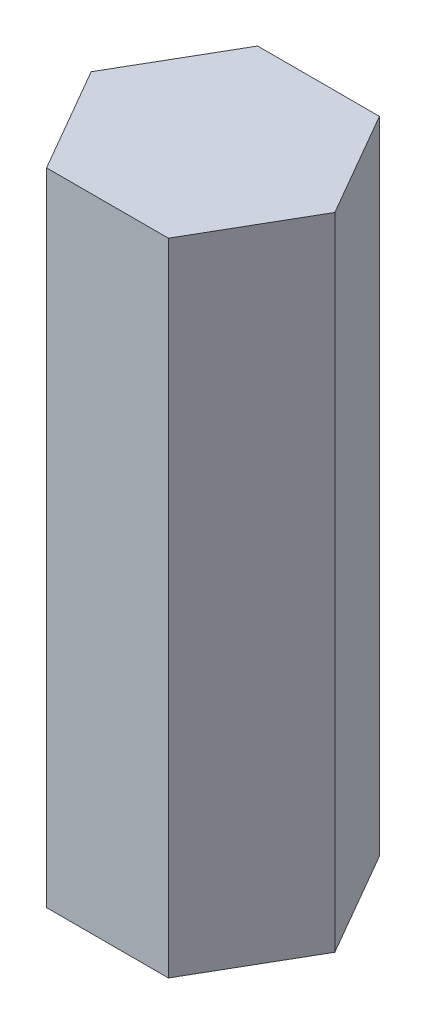
ISO-10303-21;
HEADER;
FILE_DESCRIPTION(('STEP AP214'),'2;1');
FILE_NAME('part.step','',(''),(''),'','','');
FILE_SCHEMA(('AUTOMOTIVE_DESIGN { 1 0 10303 214 1 1 1 1 }'));
ENDSEC;
DATA;
#1=APPLICATION_CONTEXT('core data for automotive mechanical design processes');
#2=APPLICATION_PROTOCOL_DEFINITION('international standard','automotive_design',2000,#1);
#3=PRODUCT_CONTEXT('',#1,'mechanical');
#4=PRODUCT('Part','Part','',(#3));
#5=PRODUCT_RELATED_PRODUCT_CATEGORY('part','',(#4));
#6=PRODUCT_DEFINITION_FORMATION('','',#4);
#7=PRODUCT_DEFINITION_CONTEXT('part definition',#1,'design');
#8=PRODUCT_DEFINITION('design','',#6,#7);
#9=PRODUCT_DEFINITION_SHAPE('','',#8);
#10=(LENGTH_UNIT() NAMED_UNIT(*) SI_UNIT(.MILLI.,.METRE.));
#11=(NAMED_UNIT(*) PLANE_ANGLE_UNIT() SI_UNIT($,.RADIAN.));
#12=(NAMED_UNIT(*) SI_UNIT($,.STERADIAN.) SOLID_ANGLE_UNIT());
#13=UNCERTAINTY_MEASURE_WITH_UNIT(LENGTH_MEASURE(1.E-05),#10,'distance_accuracy_value','');
#14=(GEOMETRIC_REPRESENTATION_CONTEXT(3) GLOBAL_UNCERTAINTY_ASSIGNED_CONTEXT((#13)) GLOBAL_UNIT_ASSIGNED_CONTEXT((#10,
#11,#12)) REPRESENTATION_CONTEXT('',''));
#15=CARTESIAN_POINT('',(0.,0.,0.));
#16=DIRECTION('',(0.,0.,1.));
#17=DIRECTION('',(1.,0.,0.));
#18=AXIS2_PLACEMENT_3D('',#15,#16,#17);
#19=CARTESIAN_POINT('',(7.33234841870825,77.1144,12.7));
#20=DIRECTION('',(-0.866025403784439,0.,-0.5));
#21=DIRECTION('',(-0.5,0.,0.866025403784439));
#22=AXIS2_PLACEMENT_3D('',#19,#20,#21);
#23=PLANE('',#22);
#24=DIRECTION('',(0.5,0.,-0.866025403784439));
#25=VECTOR('',#24,1.);
#26=CARTESIAN_POINT('',(7.33234841870825,0.,12.7));
#27=LINE('',#26,#25);
#28=CARTESIAN_POINT('',(7.33234841870825,0.,12.7));
#29=VERTEX_POINT('',#28);
#30=CARTESIAN_POINT('',(14.6646968374165,0.,0.));
#31=VERTEX_POINT('',#30);
#32=EDGE_CURVE('E119',#29,#31,#27,.T.);
#33=ORIENTED_EDGE('',*,*,#32,.T.);
#34=DIRECTION('',(0.,-1.,0.));
#35=VECTOR('',#34,1.);
#36=CARTESIAN_POINT('',(14.6646968374165,77.1144,0.));
#37=LINE('',#36,#35);
#38=CARTESIAN_POINT('',(14.6646968374165,77.1144,0.));
#39=VERTEX_POINT('',#38);
#40=EDGE_CURVE('E11',#39,#31,#37,.T.);
#41=ORIENTED_EDGE('',*,*,#40,.F.);
#42=DIRECTION('',(0.5,0.,-0.866025403784439));
#43=VECTOR('',#42,1.);
#44=CARTESIAN_POINT('',(7.33234841870825,77.1144,12.7));
#45=LINE('',#44,#43);
#46=CARTESIAN_POINT('',(7.33234841870825,77.1144,12.7));
#47=VERTEX_POINT('',#46);
#48=EDGE_CURVE('E129',#47,#39,#45,.T.);
#49=ORIENTED_EDGE('',*,*,#48,.F.);
#50=DIRECTION('',(0.,-1.,0.));
#51=VECTOR('',#50,1.);
#52=CARTESIAN_POINT('',(7.33234841870825,77.1144,12.7));
#53=LINE('',#52,#51);
#54=EDGE_CURVE('E115',#47,#29,#53,.T.);
#55=ORIENTED_EDGE('',*,*,#54,.T.);
#56=EDGE_LOOP('',(#33,#41,#49,#55));
#57=FACE_BOUND('',#56,.T.);
#58=ADVANCED_FACE('F35',(#57),#23,.F.);
#59=CARTESIAN_POINT('',(14.6646968374165,77.1144,0.));
#60=DIRECTION('',(-0.866025403784439,0.,0.5));
#61=DIRECTION('',(0.5,0.,0.866025403784439));
#62=AXIS2_PLACEMENT_3D('',#59,#60,#61);
#63=PLANE('',#62);
#64=DIRECTION('',(-0.5,0.,-0.866025403784438));
#65=VECTOR('',#64,1.);
#66=CARTESIAN_POINT('',(14.6646968374165,0.,0.));
#67=LINE('',#66,#65);
#68=CARTESIAN_POINT('',(7.33234841870824,0.,-12.7));
#69=VERTEX_POINT('',#68);
#70=EDGE_CURVE('E122',#31,#69,#67,.T.);
#71=ORIENTED_EDGE('',*,*,#70,.T.);
#72=DIRECTION('',(0.,-1.,0.));
#73=VECTOR('',#72,1.);
#74=CARTESIAN_POINT('',(7.33234841870824,77.1144,-12.7));
#75=LINE('',#74,#73);
#76=CARTESIAN_POINT('',(7.33234841870824,77.1144,-12.7));
#77=VERTEX_POINT('',#76);
#78=EDGE_CURVE('E43',#77,#69,#75,.T.);
#79=ORIENTED_EDGE('',*,*,#78,.F.);
#80=DIRECTION('',(-0.5,0.,-0.866025403784438));
#81=VECTOR('',#80,1.);
#82=CARTESIAN_POINT('',(14.6646968374165,77.1144,0.));
#83=LINE('',#82,#81);
#84=EDGE_CURVE('E88',#39,#77,#83,.T.);
#85=ORIENTED_EDGE('',*,*,#84,.F.);
#86=ORIENTED_EDGE('',*,*,#40,.T.);
#87=EDGE_LOOP('',(#71,#79,#85,#86));
#88=FACE_BOUND('',#87,.T.);
#89=ADVANCED_FACE('F153',(#88),#63,.F.);
#90=CARTESIAN_POINT('',(7.33234841870824,77.1144,-12.7));
#91=DIRECTION('',(0.,0.,1.));
#92=DIRECTION('',(1.,0.,0.));
#93=AXIS2_PLACEMENT_3D('',#90,#91,#92);
#94=PLANE('',#93);
#95=DIRECTION('',(-1.,0.,0.));
#96=VECTOR('',#95,1.);
#97=CARTESIAN_POINT('',(7.33234841870824,0.,-12.7));
#98=LINE('',#97,#96);
#99=CARTESIAN_POINT('',(-7.33234841870825,0.,-12.7));
#100=VERTEX_POINT('',#99);
#101=EDGE_CURVE('E124',#69,#100,#98,.T.);
#102=ORIENTED_EDGE('',*,*,#101,.T.);
#103=DIRECTION('',(0.,-1.,0.));
#104=VECTOR('',#103,1.);
#105=CARTESIAN_POINT('',(-7.33234841870825,77.1144,-12.7));
#106=LINE('',#105,#104);
#107=CARTESIAN_POINT('',(-7.33234841870825,77.1144,-12.7));
#108=VERTEX_POINT('',#107);
#109=EDGE_CURVE('E110',#108,#100,#106,.T.);
#110=ORIENTED_EDGE('',*,*,#109,.F.);
#111=DIRECTION('',(-1.,0.,0.));
#112=VECTOR('',#111,1.);
#113=CARTESIAN_POINT('',(7.33234841870824,77.1144,-12.7));
#114=LINE('',#113,#112);
#115=EDGE_CURVE('E101',#77,#108,#114,.T.);
#116=ORIENTED_EDGE('',*,*,#115,.F.);
#117=ORIENTED_EDGE('',*,*,#78,.T.);
#118=EDGE_LOOP('',(#102,#110,#116,#117));
#119=FACE_BOUND('',#118,.T.);
#120=ADVANCED_FACE('F135',(#119),#94,.F.);
#121=CARTESIAN_POINT('',(-7.33234841870825,77.1144,-12.7));
#122=DIRECTION('',(0.866025403784439,0.,0.5));
#123=DIRECTION('',(0.5,0.,-0.866025403784439));
#124=AXIS2_PLACEMENT_3D('',#121,#122,#123);
#125=PLANE('',#124);
#126=DIRECTION('',(-0.5,0.,0.866025403784439));
#127=VECTOR('',#126,1.);
#128=CARTESIAN_POINT('',(-7.33234841870825,0.,-12.7));
#129=LINE('',#128,#127);
#130=CARTESIAN_POINT('',(-14.6646968374165,0.,0.));
#131=VERTEX_POINT('',#130);
#132=EDGE_CURVE('E109',#100,#131,#129,.T.);
#133=ORIENTED_EDGE('',*,*,#132,.T.);
#134=DIRECTION('',(0.,-1.,0.));
#135=VECTOR('',#134,1.);
#136=CARTESIAN_POINT('',(-14.6646968374165,77.1144,0.));
#137=LINE('',#136,#135);
#138=CARTESIAN_POINT('',(-14.6646968374165,77.1144,0.));
#139=VERTEX_POINT('',#138);
#140=EDGE_CURVE('E106',#139,#131,#137,.T.);
#141=ORIENTED_EDGE('',*,*,#140,.F.);
#142=DIRECTION('',(-0.5,0.,0.866025403784439));
#143=VECTOR('',#142,1.);
#144=CARTESIAN_POINT('',(-7.33234841870825,77.1144,-12.7));
#145=LINE('',#144,#143);
#146=EDGE_CURVE('E95',#108,#139,#145,.T.);
#147=ORIENTED_EDGE('',*,*,#146,.F.);
#148=ORIENTED_EDGE('',*,*,#109,.T.);
#149=EDGE_LOOP('',(#133,#141,#147,#148));
#150=FACE_BOUND('',#149,.T.);
#151=ADVANCED_FACE('F107',(#150),#125,.F.);
#152=CARTESIAN_POINT('',(-14.6646968374165,77.1144,0.));
#153=DIRECTION('',(0.866025403784439,0.,-0.5));
#154=DIRECTION('',(-0.5,0.,-0.866025403784439));
#155=AXIS2_PLACEMENT_3D('',#152,#153,#154);
#156=PLANE('',#155);
#157=DIRECTION('',(0.5,0.,0.866025403784439));
#158=VECTOR('',#157,1.);
#159=CARTESIAN_POINT('',(-14.6646968374165,0.,0.));
#160=LINE('',#159,#158);
#161=CARTESIAN_POINT('',(-7.33234841870825,0.,12.7));
#162=VERTEX_POINT('',#161);
#163=EDGE_CURVE('E74',#131,#162,#160,.T.);
#164=ORIENTED_EDGE('',*,*,#163,.T.);
#165=DIRECTION('',(0.,-1.,0.));
#166=VECTOR('',#165,1.);
#167=CARTESIAN_POINT('',(-7.33234841870825,77.1144,12.7));
#168=LINE('',#167,#166);
#169=CARTESIAN_POINT('',(-7.33234841870825,77.1144,12.7));
#170=VERTEX_POINT('',#169);
#171=EDGE_CURVE('E111',#170,#162,#168,.T.);
#172=ORIENTED_EDGE('',*,*,#171,.F.);
#173=DIRECTION('',(0.5,0.,0.866025403784439));
#174=VECTOR('',#173,1.);
#175=CARTESIAN_POINT('',(-14.6646968374165,77.1144,0.));
#176=LINE('',#175,#174);
#177=EDGE_CURVE('E99',#139,#170,#176,.T.);
#178=ORIENTED_EDGE('',*,*,#177,.F.);
#179=ORIENTED_EDGE('',*,*,#140,.T.);
#180=EDGE_LOOP('',(#164,#172,#178,#179));
#181=FACE_BOUND('',#180,.T.);
#182=ADVANCED_FACE('F113',(#181),#156,.F.);
#183=CARTESIAN_POINT('',(-7.33234841870825,77.1144,12.7));
#184=DIRECTION('',(0.,0.,-1.));
#185=DIRECTION('',(-1.,0.,0.));
#186=AXIS2_PLACEMENT_3D('',#183,#184,#185);
#187=PLANE('',#186);
#188=DIRECTION('',(1.,0.,0.));
#189=VECTOR('',#188,1.);
#190=CARTESIAN_POINT('',(-7.33234841870825,0.,12.7));
#191=LINE('',#190,#189);
#192=EDGE_CURVE('E80',#162,#29,#191,.T.);
#193=ORIENTED_EDGE('',*,*,#192,.T.);
#194=ORIENTED_EDGE('',*,*,#54,.F.);
#195=DIRECTION('',(1.,0.,0.));
#196=VECTOR('',#195,1.);
#197=CARTESIAN_POINT('',(-7.33234841870825,77.1144,12.7));
#198=LINE('',#197,#196);
#199=EDGE_CURVE('E51',#170,#47,#198,.T.);
#200=ORIENTED_EDGE('',*,*,#199,.F.);
#201=ORIENTED_EDGE('',*,*,#171,.T.);
#202=EDGE_LOOP('',(#193,#194,#200,#201));
#203=FACE_BOUND('',#202,.T.);
#204=ADVANCED_FACE('F142',(#203),#187,.F.);
#205=CARTESIAN_POINT('',(0.,77.1144,0.));
#206=DIRECTION('',(0.,1.,0.));
#207=DIRECTION('',(0.,0.,1.));
#208=AXIS2_PLACEMENT_3D('',#205,#206,#207);
#209=PLANE('',#208);
#210=ORIENTED_EDGE('',*,*,#48,.T.);
#211=ORIENTED_EDGE('',*,*,#84,.T.);
#212=ORIENTED_EDGE('',*,*,#115,.T.);
#213=ORIENTED_EDGE('',*,*,#146,.T.);
#214=ORIENTED_EDGE('',*,*,#177,.T.);
#215=ORIENTED_EDGE('',*,*,#199,.T.);
#216=EDGE_LOOP('',(#210,#211,#212,#213,#214,#215));
#217=FACE_BOUND('',#216,.T.);
#218=ADVANCED_FACE('F97',(#217),#209,.T.);
#219=CARTESIAN_POINT('',(0.,0.,0.));
#220=DIRECTION('',(0.,1.,0.));
#221=DIRECTION('',(0.,0.,1.));
#222=AXIS2_PLACEMENT_3D('',#219,#220,#221);
#223=PLANE('',#222);
#224=ORIENTED_EDGE('',*,*,#32,.F.);
#225=ORIENTED_EDGE('',*,*,#192,.F.);
#226=ORIENTED_EDGE('',*,*,#163,.F.);
#227=ORIENTED_EDGE('',*,*,#132,.F.);
#228=ORIENTED_EDGE('',*,*,#101,.F.);
#229=ORIENTED_EDGE('',*,*,#70,.F.);
#230=EDGE_LOOP('',(#224,#225,#226,#227,#228,#229));
#231=FACE_BOUND('',#230,.T.);
#232=ADVANCED_FACE('F138',(#231),#223,.F.);
#233=CLOSED_SHELL('',(#58,#89,#120,#151,#182,#204,#218,#232));
#234=MANIFOLD_SOLID_BREP('B2',#233);
#235=ADVANCED_BREP_SHAPE_REPRESENTATION('',(#18,#234),#14);
#236=SHAPE_DEFINITION_REPRESENTATION(#9,#235);
ENDSEC;
END-ISO-10303-21;
